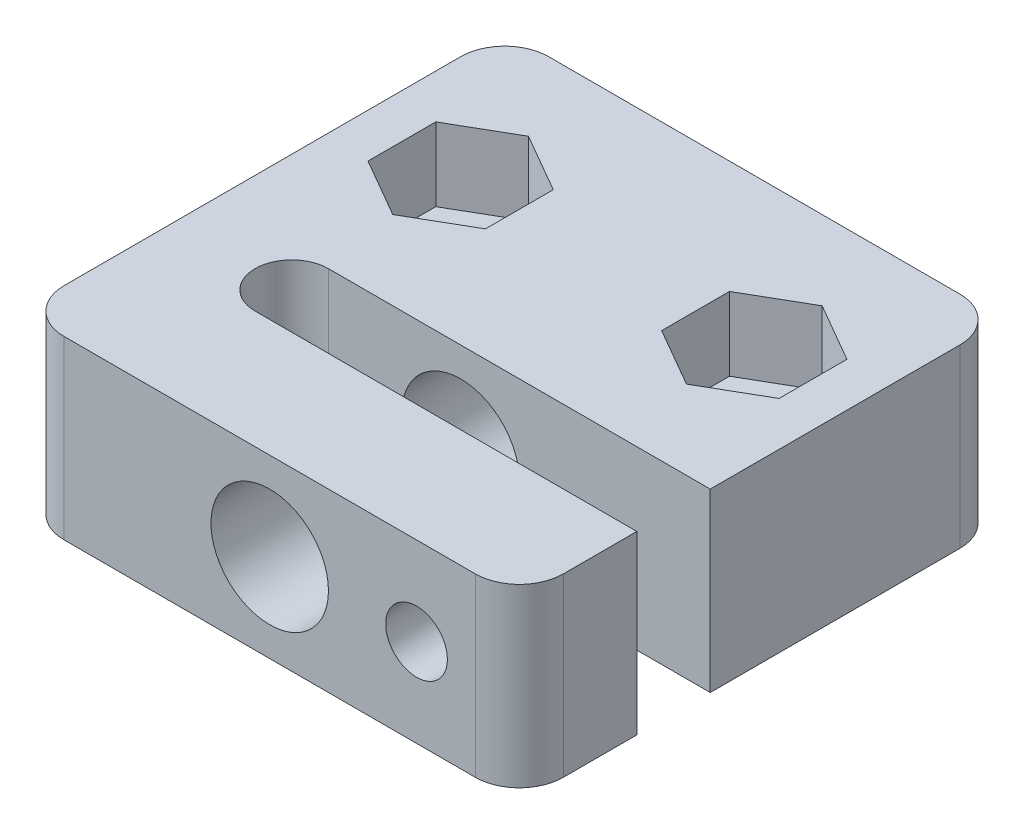
ISO-10303-21;
HEADER;
FILE_DESCRIPTION(('STEP AP214'),'2;1');
FILE_NAME('part.step','',(''),(''),'','','');
FILE_SCHEMA(('AUTOMOTIVE_DESIGN { 1 0 10303 214 1 1 1 1 }'));
ENDSEC;
DATA;
#1=APPLICATION_CONTEXT('core data for automotive mechanical design processes');
#2=APPLICATION_PROTOCOL_DEFINITION('international standard','automotive_design',2000,#1);
#3=PRODUCT_CONTEXT('',#1,'mechanical');
#4=PRODUCT('Part','Part','',(#3));
#5=PRODUCT_RELATED_PRODUCT_CATEGORY('part','',(#4));
#6=PRODUCT_DEFINITION_FORMATION('','',#4);
#7=PRODUCT_DEFINITION_CONTEXT('part definition',#1,'design');
#8=PRODUCT_DEFINITION('design','',#6,#7);
#9=PRODUCT_DEFINITION_SHAPE('','',#8);
#10=(LENGTH_UNIT() NAMED_UNIT(*) SI_UNIT(.MILLI.,.METRE.));
#11=(NAMED_UNIT(*) PLANE_ANGLE_UNIT() SI_UNIT($,.RADIAN.));
#12=(NAMED_UNIT(*) SI_UNIT($,.STERADIAN.) SOLID_ANGLE_UNIT());
#13=UNCERTAINTY_MEASURE_WITH_UNIT(LENGTH_MEASURE(1.E-05),#10,'distance_accuracy_value','');
#14=(GEOMETRIC_REPRESENTATION_CONTEXT(3) GLOBAL_UNCERTAINTY_ASSIGNED_CONTEXT((#13)) GLOBAL_UNIT_ASSIGNED_CONTEXT((#10,
#11,#12)) REPRESENTATION_CONTEXT('',''));
#15=CARTESIAN_POINT('',(0.,0.,0.));
#16=DIRECTION('',(0.,0.,1.));
#17=DIRECTION('',(1.,0.,0.));
#18=AXIS2_PLACEMENT_3D('',#15,#16,#17);
#19=CARTESIAN_POINT('',(17.,-6.,16.5));
#20=DIRECTION('',(-1.,0.,0.));
#21=DIRECTION('',(0.,0.,1.));
#22=AXIS2_PLACEMENT_3D('',#19,#20,#21);
#23=PLANE('',#22);
#24=DIRECTION('',(0.,0.,-1.));
#25=VECTOR('',#24,1.);
#26=CARTESIAN_POINT('',(17.,6.,16.5));
#27=LINE('',#26,#25);
#28=CARTESIAN_POINT('',(17.,6.,13.5));
#29=VERTEX_POINT('',#28);
#30=CARTESIAN_POINT('',(17.,6.,8.5));
#31=VERTEX_POINT('',#30);
#32=EDGE_CURVE('E227',#29,#31,#27,.T.);
#33=ORIENTED_EDGE('',*,*,#32,.F.);
#34=DIRECTION('',(0.,1.,0.));
#35=VECTOR('',#34,1.);
#36=CARTESIAN_POINT('',(17.,-6.,13.5));
#37=LINE('',#36,#35);
#38=CARTESIAN_POINT('',(17.,-6.,13.5));
#39=VERTEX_POINT('',#38);
#40=EDGE_CURVE('E11',#29,#39,#37,.F.);
#41=ORIENTED_EDGE('',*,*,#40,.T.);
#42=DIRECTION('',(0.,0.,-1.));
#43=VECTOR('',#42,1.);
#44=CARTESIAN_POINT('',(17.,-6.,16.5));
#45=LINE('',#44,#43);
#46=CARTESIAN_POINT('',(17.,-6.,8.5));
#47=VERTEX_POINT('',#46);
#48=EDGE_CURVE('E226',#39,#47,#45,.T.);
#49=ORIENTED_EDGE('',*,*,#48,.T.);
#50=DIRECTION('',(0.,1.,0.));
#51=VECTOR('',#50,1.);
#52=CARTESIAN_POINT('',(17.,-6.,8.5));
#53=LINE('',#52,#51);
#54=EDGE_CURVE('E259',#47,#31,#53,.T.);
#55=ORIENTED_EDGE('',*,*,#54,.T.);
#56=EDGE_LOOP('',(#33,#41,#49,#55));
#57=FACE_BOUND('',#56,.T.);
#58=ADVANCED_FACE('F33',(#57),#23,.F.);
#59=CARTESIAN_POINT('',(0.,0.,-16.5));
#60=DIRECTION('',(0.,0.,1.));
#61=DIRECTION('',(1.,0.,0.));
#62=AXIS2_PLACEMENT_3D('',#59,#60,#61);
#63=CYLINDRICAL_SURFACE('',#62,4.);
#64=CARTESIAN_POINT('',(0.,0.,8.5));
#65=DIRECTION('',(0.,0.,1.));
#66=DIRECTION('',(1.,0.,0.));
#67=AXIS2_PLACEMENT_3D('',#64,#65,#66);
#68=CIRCLE('',#67,4.);
#69=CARTESIAN_POINT('',(4.,0.,8.5));
#70=VERTEX_POINT('',#69);
#71=EDGE_CURVE('E258',#70,#70,#68,.F.);
#72=ORIENTED_EDGE('',*,*,#71,.T.);
#73=EDGE_LOOP('',(#72));
#74=FACE_BOUND('',#73,.T.);
#75=CARTESIAN_POINT('',(0.,0.,16.5));
#76=DIRECTION('',(0.,0.,1.));
#77=DIRECTION('',(1.,0.,0.));
#78=AXIS2_PLACEMENT_3D('',#75,#76,#77);
#79=CIRCLE('',#78,4.);
#80=CARTESIAN_POINT('',(4.,0.,16.5));
#81=VERTEX_POINT('',#80);
#82=EDGE_CURVE('E238',#81,#81,#79,.T.);
#83=ORIENTED_EDGE('',*,*,#82,.T.);
#84=EDGE_LOOP('',(#83));
#85=FACE_BOUND('',#84,.T.);
#86=ADVANCED_FACE('F330',(#74,#85),#63,.F.);
#87=CARTESIAN_POINT('',(-10.,-6.00000000000001,-6.5));
#88=DIRECTION('',(0.,1.,0.));
#89=DIRECTION('',(-1.,0.,0.));
#90=AXIS2_PLACEMENT_3D('',#87,#88,#89);
#91=CYLINDRICAL_SURFACE('',#90,2.55);
#92=CARTESIAN_POINT('',(-10.,1.,-6.5));
#93=DIRECTION('',(0.,1.,0.));
#94=DIRECTION('',(0.,0.,1.));
#95=AXIS2_PLACEMENT_3D('',#92,#93,#94);
#96=CIRCLE('',#95,2.55);
#97=CARTESIAN_POINT('',(-10.,1.,-3.95));
#98=VERTEX_POINT('',#97);
#99=EDGE_CURVE('E235',#98,#98,#96,.F.);
#100=ORIENTED_EDGE('',*,*,#99,.F.);
#101=EDGE_LOOP('',(#100));
#102=FACE_BOUND('',#101,.T.);
#103=CARTESIAN_POINT('',(-10.,-4.,-6.5));
#104=DIRECTION('',(0.,-1.,0.));
#105=DIRECTION('',(1.,0.,0.));
#106=AXIS2_PLACEMENT_3D('',#103,#104,#105);
#107=CIRCLE('',#106,2.55);
#108=CARTESIAN_POINT('',(-7.45,-4.,-6.5));
#109=VERTEX_POINT('',#108);
#110=EDGE_CURVE('E250',#109,#109,#107,.F.);
#111=ORIENTED_EDGE('',*,*,#110,.F.);
#112=EDGE_LOOP('',(#111));
#113=FACE_BOUND('',#112,.T.);
#114=ADVANCED_FACE('F336',(#102,#113),#91,.F.);
#115=CARTESIAN_POINT('',(10.,-6.00000000000001,-6.5));
#116=DIRECTION('',(0.,1.,0.));
#117=DIRECTION('',(-1.,0.,0.));
#118=AXIS2_PLACEMENT_3D('',#115,#116,#117);
#119=CYLINDRICAL_SURFACE('',#118,2.55);
#120=CARTESIAN_POINT('',(10.,1.,-6.5));
#121=DIRECTION('',(0.,-1.,0.));
#122=DIRECTION('',(1.,0.,0.));
#123=AXIS2_PLACEMENT_3D('',#120,#121,#122);
#124=CIRCLE('',#123,2.55);
#125=CARTESIAN_POINT('',(12.55,1.,-6.5));
#126=VERTEX_POINT('',#125);
#127=EDGE_CURVE('E240',#126,#126,#124,.F.);
#128=ORIENTED_EDGE('',*,*,#127,.T.);
#129=EDGE_LOOP('',(#128));
#130=FACE_BOUND('',#129,.T.);
#131=CARTESIAN_POINT('',(10.,-4.,-6.5));
#132=DIRECTION('',(0.,-1.,0.));
#133=DIRECTION('',(1.,0.,0.));
#134=AXIS2_PLACEMENT_3D('',#131,#132,#133);
#135=CIRCLE('',#134,2.55);
#136=CARTESIAN_POINT('',(12.55,-4.,-6.5));
#137=VERTEX_POINT('',#136);
#138=EDGE_CURVE('E245',#137,#137,#135,.F.);
#139=ORIENTED_EDGE('',*,*,#138,.F.);
#140=EDGE_LOOP('',(#139));
#141=FACE_BOUND('',#140,.T.);
#142=ADVANCED_FACE('F352',(#130,#141),#119,.F.);
#143=CARTESIAN_POINT('',(-17.,-6.,16.5));
#144=DIRECTION('',(1.,0.,0.));
#145=DIRECTION('',(0.,0.,-1.));
#146=AXIS2_PLACEMENT_3D('',#143,#144,#145);
#147=PLANE('',#146);
#148=DIRECTION('',(0.,0.,-1.));
#149=VECTOR('',#148,1.);
#150=CARTESIAN_POINT('',(-17.,6.,16.5));
#151=LINE('',#150,#149);
#152=CARTESIAN_POINT('',(-17.,6.,13.5));
#153=VERTEX_POINT('',#152);
#154=CARTESIAN_POINT('',(-17.,6.,-13.5));
#155=VERTEX_POINT('',#154);
#156=EDGE_CURVE('E299',#153,#155,#151,.T.);
#157=ORIENTED_EDGE('',*,*,#156,.T.);
#158=DIRECTION('',(0.,-1.,0.));
#159=VECTOR('',#158,1.);
#160=CARTESIAN_POINT('',(-17.,-6.,-13.5));
#161=LINE('',#160,#159);
#162=CARTESIAN_POINT('',(-17.,-6.,-13.5));
#163=VERTEX_POINT('',#162);
#164=EDGE_CURVE('E264',#155,#163,#161,.T.);
#165=ORIENTED_EDGE('',*,*,#164,.T.);
#166=DIRECTION('',(0.,0.,-1.));
#167=VECTOR('',#166,1.);
#168=CARTESIAN_POINT('',(-17.,-6.,16.5));
#169=LINE('',#168,#167);
#170=CARTESIAN_POINT('',(-17.,-6.,13.5));
#171=VERTEX_POINT('',#170);
#172=EDGE_CURVE('E229',#171,#163,#169,.T.);
#173=ORIENTED_EDGE('',*,*,#172,.F.);
#174=DIRECTION('',(0.,-1.,0.));
#175=VECTOR('',#174,1.);
#176=CARTESIAN_POINT('',(-17.,6.,13.5));
#177=LINE('',#176,#175);
#178=EDGE_CURVE('E234',#171,#153,#177,.F.);
#179=ORIENTED_EDGE('',*,*,#178,.T.);
#180=EDGE_LOOP('',(#157,#165,#173,#179));
#181=FACE_BOUND('',#180,.T.);
#182=ADVANCED_FACE('F319',(#181),#147,.F.);
#183=CARTESIAN_POINT('',(17.,-6.,16.5));
#184=DIRECTION('',(0.,1.,0.));
#185=DIRECTION('',(-1.,0.,0.));
#186=AXIS2_PLACEMENT_3D('',#183,#184,#185);
#187=PLANE('',#186);
#188=CARTESIAN_POINT('',(-10.,-6.,-6.5));
#189=DIRECTION('',(0.,-1.,0.));
#190=DIRECTION('',(1.,0.,0.));
#191=AXIS2_PLACEMENT_3D('',#188,#189,#190);
#192=CIRCLE('',#191,4.5);
#193=CARTESIAN_POINT('',(-5.5,-6.,-6.5));
#194=VERTEX_POINT('',#193);
#195=EDGE_CURVE('E262',#194,#194,#192,.T.);
#196=ORIENTED_EDGE('',*,*,#195,.F.);
#197=EDGE_LOOP('',(#196));
#198=FACE_BOUND('',#197,.T.);
#199=CARTESIAN_POINT('',(10.,-6.,-6.5));
#200=DIRECTION('',(0.,-1.,0.));
#201=DIRECTION('',(1.,0.,0.));
#202=AXIS2_PLACEMENT_3D('',#199,#200,#201);
#203=CIRCLE('',#202,4.5);
#204=CARTESIAN_POINT('',(14.5,-6.,-6.5));
#205=VERTEX_POINT('',#204);
#206=EDGE_CURVE('E253',#205,#205,#203,.T.);
#207=ORIENTED_EDGE('',*,*,#206,.F.);
#208=EDGE_LOOP('',(#207));
#209=FACE_BOUND('',#208,.T.);
#210=ORIENTED_EDGE('',*,*,#172,.T.);
#211=CARTESIAN_POINT('',(-14.,-6.,-13.5));
#212=DIRECTION('',(0.,1.,0.));
#213=DIRECTION('',(-1.,0.,0.));
#214=AXIS2_PLACEMENT_3D('',#211,#212,#213);
#215=CIRCLE('',#214,3.);
#216=CARTESIAN_POINT('',(-14.,-6.,-16.5));
#217=VERTEX_POINT('',#216);
#218=EDGE_CURVE('E272',#163,#217,#215,.F.);
#219=ORIENTED_EDGE('',*,*,#218,.T.);
#220=DIRECTION('',(1.,0.,0.));
#221=VECTOR('',#220,1.);
#222=CARTESIAN_POINT('',(17.,-6.,-16.5));
#223=LINE('',#222,#221);
#224=CARTESIAN_POINT('',(14.,-6.,-16.5));
#225=VERTEX_POINT('',#224);
#226=EDGE_CURVE('E306',#217,#225,#223,.T.);
#227=ORIENTED_EDGE('',*,*,#226,.T.);
#228=CARTESIAN_POINT('',(14.,-6.,-13.5));
#229=DIRECTION('',(0.,1.,0.));
#230=DIRECTION('',(-1.,0.,0.));
#231=AXIS2_PLACEMENT_3D('',#228,#229,#230);
#232=CIRCLE('',#231,3.);
#233=CARTESIAN_POINT('',(17.,-6.,-13.5));
#234=VERTEX_POINT('',#233);
#235=EDGE_CURVE('E225',#225,#234,#232,.F.);
#236=ORIENTED_EDGE('',*,*,#235,.T.);
#237=CARTESIAN_POINT('',(17.,-6.,3.5));
#238=VERTEX_POINT('',#237);
#239=EDGE_CURVE('E215',#238,#234,#45,.T.);
#240=ORIENTED_EDGE('',*,*,#239,.F.);
#241=DIRECTION('',(-1.,0.,0.));
#242=VECTOR('',#241,1.);
#243=CARTESIAN_POINT('',(17.,-6.,3.5));
#244=LINE('',#243,#242);
#245=CARTESIAN_POINT('',(-9.,-6.00000000000001,3.5));
#246=VERTEX_POINT('',#245);
#247=EDGE_CURVE('E195',#238,#246,#244,.T.);
#248=ORIENTED_EDGE('',*,*,#247,.T.);
#249=CARTESIAN_POINT('',(-9.,-6.00000000000001,6.));
#250=DIRECTION('',(0.,1.,0.));
#251=DIRECTION('',(-1.,0.,0.));
#252=AXIS2_PLACEMENT_3D('',#249,#250,#251);
#253=CIRCLE('',#252,2.5);
#254=CARTESIAN_POINT('',(-9.,-6.00000000000001,8.5));
#255=VERTEX_POINT('',#254);
#256=EDGE_CURVE('E207',#246,#255,#253,.T.);
#257=ORIENTED_EDGE('',*,*,#256,.T.);
#258=DIRECTION('',(1.,0.,0.));
#259=VECTOR('',#258,1.);
#260=CARTESIAN_POINT('',(17.,-6.,8.5));
#261=LINE('',#260,#259);
#262=EDGE_CURVE('E219',#255,#47,#261,.T.);
#263=ORIENTED_EDGE('',*,*,#262,.T.);
#264=ORIENTED_EDGE('',*,*,#48,.F.);
#265=CARTESIAN_POINT('',(14.,-6.,13.5));
#266=DIRECTION('',(0.,1.,0.));
#267=DIRECTION('',(-1.,0.,0.));
#268=AXIS2_PLACEMENT_3D('',#265,#266,#267);
#269=CIRCLE('',#268,3.);
#270=CARTESIAN_POINT('',(14.,-6.,16.5));
#271=VERTEX_POINT('',#270);
#272=EDGE_CURVE('E269',#39,#271,#269,.F.);
#273=ORIENTED_EDGE('',*,*,#272,.T.);
#274=DIRECTION('',(1.,0.,0.));
#275=VECTOR('',#274,1.);
#276=CARTESIAN_POINT('',(17.,-6.,16.5));
#277=LINE('',#276,#275);
#278=CARTESIAN_POINT('',(-14.,-6.,16.5));
#279=VERTEX_POINT('',#278);
#280=EDGE_CURVE('E294',#279,#271,#277,.T.);
#281=ORIENTED_EDGE('',*,*,#280,.F.);
#282=CARTESIAN_POINT('',(-14.,-6.,13.5));
#283=DIRECTION('',(0.,1.,0.));
#284=DIRECTION('',(-1.,0.,0.));
#285=AXIS2_PLACEMENT_3D('',#282,#283,#284);
#286=CIRCLE('',#285,3.);
#287=EDGE_CURVE('E267',#279,#171,#286,.F.);
#288=ORIENTED_EDGE('',*,*,#287,.T.);
#289=EDGE_LOOP('',(#210,#219,#227,#236,#240,#248,#257,#263,#264,#273,#281,#288));
#290=FACE_BOUND('',#289,.T.);
#291=ADVANCED_FACE('F222',(#198,#209,#290),#187,.F.);
#292=ORIENTED_EDGE('',*,*,#239,.T.);
#293=DIRECTION('',(0.,1.,0.));
#294=VECTOR('',#293,1.);
#295=CARTESIAN_POINT('',(17.,-6.,-13.5));
#296=LINE('',#295,#294);
#297=CARTESIAN_POINT('',(17.,6.,-13.5));
#298=VERTEX_POINT('',#297);
#299=EDGE_CURVE('E284',#234,#298,#296,.T.);
#300=ORIENTED_EDGE('',*,*,#299,.T.);
#301=CARTESIAN_POINT('',(17.,6.,3.5));
#302=VERTEX_POINT('',#301);
#303=EDGE_CURVE('E218',#302,#298,#27,.T.);
#304=ORIENTED_EDGE('',*,*,#303,.F.);
#305=DIRECTION('',(0.,1.,0.));
#306=VECTOR('',#305,1.);
#307=CARTESIAN_POINT('',(17.,-6.,3.5));
#308=LINE('',#307,#306);
#309=EDGE_CURVE('E200',#238,#302,#308,.T.);
#310=ORIENTED_EDGE('',*,*,#309,.F.);
#311=EDGE_LOOP('',(#292,#300,#304,#310));
#312=FACE_BOUND('',#311,.T.);
#313=ADVANCED_FACE('F213',(#312),#23,.F.);
#314=CARTESIAN_POINT('',(17.,6.,16.5));
#315=DIRECTION('',(0.,-1.,0.));
#316=DIRECTION('',(1.,0.,0.));
#317=AXIS2_PLACEMENT_3D('',#314,#315,#316);
#318=PLANE('',#317);
#319=DIRECTION('',(0.866025403784439,0.,0.5));
#320=VECTOR('',#319,1.);
#321=CARTESIAN_POINT('',(10.,6.,-1.881197846483));
#322=LINE('',#321,#320);
#323=CARTESIAN_POINT('',(6.00000000000001,6.,-4.1905989232415));
#324=VERTEX_POINT('',#323);
#325=CARTESIAN_POINT('',(10.,6.,-1.881197846483));
#326=VERTEX_POINT('',#325);
#327=EDGE_CURVE('E414',#324,#326,#322,.T.);
#328=ORIENTED_EDGE('',*,*,#327,.F.);
#329=DIRECTION('',(0.,0.,1.));
#330=VECTOR('',#329,1.);
#331=CARTESIAN_POINT('',(6.,6.,-4.19059892324149));
#332=LINE('',#331,#330);
#333=CARTESIAN_POINT('',(6.,6.,-8.8094010767585));
#334=VERTEX_POINT('',#333);
#335=EDGE_CURVE('E248',#334,#324,#332,.T.);
#336=ORIENTED_EDGE('',*,*,#335,.F.);
#337=DIRECTION('',(-0.866025403784439,0.,0.499999999999999));
#338=VECTOR('',#337,1.);
#339=CARTESIAN_POINT('',(6.,6.,-8.8094010767585));
#340=LINE('',#339,#338);
#341=CARTESIAN_POINT('',(10.,6.,-11.118802153517));
#342=VERTEX_POINT('',#341);
#343=EDGE_CURVE('E397',#342,#334,#340,.T.);
#344=ORIENTED_EDGE('',*,*,#343,.F.);
#345=DIRECTION('',(-0.866025403784439,0.,-0.5));
#346=VECTOR('',#345,1.);
#347=CARTESIAN_POINT('',(10.,6.,-11.118802153517));
#348=LINE('',#347,#346);
#349=CARTESIAN_POINT('',(14.,6.,-8.8094010767585));
#350=VERTEX_POINT('',#349);
#351=EDGE_CURVE('E423',#350,#342,#348,.T.);
#352=ORIENTED_EDGE('',*,*,#351,.F.);
#353=DIRECTION('',(0.,0.,-1.));
#354=VECTOR('',#353,1.);
#355=CARTESIAN_POINT('',(14.,6.,-8.8094010767585));
#356=LINE('',#355,#354);
#357=CARTESIAN_POINT('',(14.,6.,-4.1905989232415));
#358=VERTEX_POINT('',#357);
#359=EDGE_CURVE('E420',#358,#350,#356,.T.);
#360=ORIENTED_EDGE('',*,*,#359,.F.);
#361=DIRECTION('',(0.866025403784439,0.,-0.5));
#362=VECTOR('',#361,1.);
#363=CARTESIAN_POINT('',(14.,6.,-4.1905989232415));
#364=LINE('',#363,#362);
#365=EDGE_CURVE('E417',#326,#358,#364,.T.);
#366=ORIENTED_EDGE('',*,*,#365,.F.);
#367=EDGE_LOOP('',(#328,#336,#344,#352,#360,#366));
#368=FACE_BOUND('',#367,.T.);
#369=DIRECTION('',(-0.866025403784439,0.,0.499999999999999));
#370=VECTOR('',#369,1.);
#371=CARTESIAN_POINT('',(-10.,6.,-11.118802153517));
#372=LINE('',#371,#370);
#373=CARTESIAN_POINT('',(-10.,6.,-11.118802153517));
#374=VERTEX_POINT('',#373);
#375=CARTESIAN_POINT('',(-14.,6.,-8.8094010767585));
#376=VERTEX_POINT('',#375);
#377=EDGE_CURVE('E460',#374,#376,#372,.T.);
#378=ORIENTED_EDGE('',*,*,#377,.F.);
#379=DIRECTION('',(-0.866025403784439,0.,-0.499999999999999));
#380=VECTOR('',#379,1.);
#381=CARTESIAN_POINT('',(-6.,6.,-8.8094010767585));
#382=LINE('',#381,#380);
#383=CARTESIAN_POINT('',(-6.,6.,-8.8094010767585));
#384=VERTEX_POINT('',#383);
#385=EDGE_CURVE('E243',#384,#374,#382,.T.);
#386=ORIENTED_EDGE('',*,*,#385,.F.);
#387=DIRECTION('',(0.,0.,-1.));
#388=VECTOR('',#387,1.);
#389=CARTESIAN_POINT('',(-6.00000000000001,6.,-4.19059892324149));
#390=LINE('',#389,#388);
#391=CARTESIAN_POINT('',(-6.00000000000001,6.,-4.19059892324149));
#392=VERTEX_POINT('',#391);
#393=EDGE_CURVE('E443',#392,#384,#390,.T.);
#394=ORIENTED_EDGE('',*,*,#393,.F.);
#395=DIRECTION('',(0.866025403784439,0.,-0.5));
#396=VECTOR('',#395,1.);
#397=CARTESIAN_POINT('',(-10.,6.,-1.881197846483));
#398=LINE('',#397,#396);
#399=CARTESIAN_POINT('',(-10.,6.,-1.881197846483));
#400=VERTEX_POINT('',#399);
#401=EDGE_CURVE('E469',#400,#392,#398,.T.);
#402=ORIENTED_EDGE('',*,*,#401,.F.);
#403=DIRECTION('',(0.866025403784439,0.,0.5));
#404=VECTOR('',#403,1.);
#405=CARTESIAN_POINT('',(-14.,6.,-4.1905989232415));
#406=LINE('',#405,#404);
#407=CARTESIAN_POINT('',(-14.,6.,-4.1905989232415));
#408=VERTEX_POINT('',#407);
#409=EDGE_CURVE('E466',#408,#400,#406,.T.);
#410=ORIENTED_EDGE('',*,*,#409,.F.);
#411=DIRECTION('',(0.,0.,1.));
#412=VECTOR('',#411,1.);
#413=CARTESIAN_POINT('',(-14.,6.,-8.8094010767585));
#414=LINE('',#413,#412);
#415=EDGE_CURVE('E463',#376,#408,#414,.T.);
#416=ORIENTED_EDGE('',*,*,#415,.F.);
#417=EDGE_LOOP('',(#378,#386,#394,#402,#410,#416));
#418=FACE_BOUND('',#417,.T.);
#419=DIRECTION('',(-1.,0.,0.));
#420=VECTOR('',#419,1.);
#421=CARTESIAN_POINT('',(17.,6.,-16.5));
#422=LINE('',#421,#420);
#423=CARTESIAN_POINT('',(14.,6.,-16.5));
#424=VERTEX_POINT('',#423);
#425=CARTESIAN_POINT('',(-14.,6.,-16.5));
#426=VERTEX_POINT('',#425);
#427=EDGE_CURVE('E302',#424,#426,#422,.T.);
#428=ORIENTED_EDGE('',*,*,#427,.T.);
#429=CARTESIAN_POINT('',(-14.,6.,-13.5));
#430=DIRECTION('',(0.,-1.,0.));
#431=DIRECTION('',(1.,0.,0.));
#432=AXIS2_PLACEMENT_3D('',#429,#430,#431);
#433=CIRCLE('',#432,3.);
#434=EDGE_CURVE('E282',#426,#155,#433,.F.);
#435=ORIENTED_EDGE('',*,*,#434,.T.);
#436=ORIENTED_EDGE('',*,*,#156,.F.);
#437=CARTESIAN_POINT('',(-14.,6.,13.5));
#438=DIRECTION('',(0.,-1.,0.));
#439=DIRECTION('',(1.,0.,0.));
#440=AXIS2_PLACEMENT_3D('',#437,#438,#439);
#441=CIRCLE('',#440,3.);
#442=CARTESIAN_POINT('',(-14.,6.,16.5));
#443=VERTEX_POINT('',#442);
#444=EDGE_CURVE('E48',#153,#443,#441,.F.);
#445=ORIENTED_EDGE('',*,*,#444,.T.);
#446=DIRECTION('',(-1.,0.,0.));
#447=VECTOR('',#446,1.);
#448=CARTESIAN_POINT('',(17.,6.,16.5));
#449=LINE('',#448,#447);
#450=CARTESIAN_POINT('',(14.,6.,16.5));
#451=VERTEX_POINT('',#450);
#452=EDGE_CURVE('E291',#451,#443,#449,.T.);
#453=ORIENTED_EDGE('',*,*,#452,.F.);
#454=CARTESIAN_POINT('',(14.,6.,13.5));
#455=DIRECTION('',(0.,-1.,0.));
#456=DIRECTION('',(1.,0.,0.));
#457=AXIS2_PLACEMENT_3D('',#454,#455,#456);
#458=CIRCLE('',#457,3.);
#459=EDGE_CURVE('E56',#451,#29,#458,.F.);
#460=ORIENTED_EDGE('',*,*,#459,.T.);
#461=ORIENTED_EDGE('',*,*,#32,.T.);
#462=DIRECTION('',(1.,0.,0.));
#463=VECTOR('',#462,1.);
#464=CARTESIAN_POINT('',(17.,6.,8.5));
#465=LINE('',#464,#463);
#466=CARTESIAN_POINT('',(-9.,6.,8.5));
#467=VERTEX_POINT('',#466);
#468=EDGE_CURVE('E208',#467,#31,#465,.T.);
#469=ORIENTED_EDGE('',*,*,#468,.F.);
#470=CARTESIAN_POINT('',(-9.,6.,6.));
#471=DIRECTION('',(0.,1.,0.));
#472=DIRECTION('',(-1.,0.,0.));
#473=AXIS2_PLACEMENT_3D('',#470,#471,#472);
#474=CIRCLE('',#473,2.5);
#475=CARTESIAN_POINT('',(-9.,6.,3.5));
#476=VERTEX_POINT('',#475);
#477=EDGE_CURVE('E368',#476,#467,#474,.T.);
#478=ORIENTED_EDGE('',*,*,#477,.F.);
#479=DIRECTION('',(-1.,0.,0.));
#480=VECTOR('',#479,1.);
#481=CARTESIAN_POINT('',(17.,6.,3.5));
#482=LINE('',#481,#480);
#483=EDGE_CURVE('E365',#302,#476,#482,.T.);
#484=ORIENTED_EDGE('',*,*,#483,.F.);
#485=ORIENTED_EDGE('',*,*,#303,.T.);
#486=CARTESIAN_POINT('',(14.,6.,-13.5));
#487=DIRECTION('',(0.,-1.,0.));
#488=DIRECTION('',(1.,0.,0.));
#489=AXIS2_PLACEMENT_3D('',#486,#487,#488);
#490=CIRCLE('',#489,3.);
#491=EDGE_CURVE('E280',#298,#424,#490,.F.);
#492=ORIENTED_EDGE('',*,*,#491,.T.);
#493=EDGE_LOOP('',(#428,#435,#436,#445,#453,#460,#461,#469,#478,#484,#485,#492));
#494=FACE_BOUND('',#493,.T.);
#495=ADVANCED_FACE('F297',(#368,#418,#494),#318,.F.);
#496=CARTESIAN_POINT('',(0.,0.,16.5));
#497=DIRECTION('',(0.,0.,1.));
#498=DIRECTION('',(1.,0.,0.));
#499=AXIS2_PLACEMENT_3D('',#496,#497,#498);
#500=PLANE('',#499);
#501=CARTESIAN_POINT('',(10.,0.,16.5));
#502=DIRECTION('',(0.,0.,1.));
#503=DIRECTION('',(1.,0.,0.));
#504=AXIS2_PLACEMENT_3D('',#501,#502,#503);
#505=CIRCLE('',#504,2.09999999999999);
#506=CARTESIAN_POINT('',(12.1,0.,16.5));
#507=VERTEX_POINT('',#506);
#508=EDGE_CURVE('E373',#507,#507,#505,.T.);
#509=ORIENTED_EDGE('',*,*,#508,.F.);
#510=EDGE_LOOP('',(#509));
#511=FACE_BOUND('',#510,.T.);
#512=ORIENTED_EDGE('',*,*,#82,.F.);
#513=EDGE_LOOP('',(#512));
#514=FACE_BOUND('',#513,.T.);
#515=ORIENTED_EDGE('',*,*,#280,.T.);
#516=DIRECTION('',(0.,1.,0.));
#517=VECTOR('',#516,1.);
#518=CARTESIAN_POINT('',(14.,6.,16.5));
#519=LINE('',#518,#517);
#520=EDGE_CURVE('E41',#271,#451,#519,.T.);
#521=ORIENTED_EDGE('',*,*,#520,.T.);
#522=ORIENTED_EDGE('',*,*,#452,.T.);
#523=DIRECTION('',(0.,-1.,0.));
#524=VECTOR('',#523,1.);
#525=CARTESIAN_POINT('',(-14.,-6.,16.5));
#526=LINE('',#525,#524);
#527=EDGE_CURVE('E286',#443,#279,#526,.T.);
#528=ORIENTED_EDGE('',*,*,#527,.T.);
#529=EDGE_LOOP('',(#515,#521,#522,#528));
#530=FACE_BOUND('',#529,.T.);
#531=ADVANCED_FACE('F290',(#511,#514,#530),#500,.T.);
#532=CARTESIAN_POINT('',(0.,0.,-16.5));
#533=DIRECTION('',(0.,0.,1.));
#534=DIRECTION('',(1.,0.,0.));
#535=AXIS2_PLACEMENT_3D('',#532,#533,#534);
#536=PLANE('',#535);
#537=CARTESIAN_POINT('',(0.,0.,-16.5));
#538=DIRECTION('',(0.,0.,1.));
#539=DIRECTION('',(1.,0.,0.));
#540=AXIS2_PLACEMENT_3D('',#537,#538,#539);
#541=CIRCLE('',#540,4.);
#542=CARTESIAN_POINT('',(4.,0.,-16.5));
#543=VERTEX_POINT('',#542);
#544=EDGE_CURVE('E308',#543,#543,#541,.T.);
#545=ORIENTED_EDGE('',*,*,#544,.T.);
#546=EDGE_LOOP('',(#545));
#547=FACE_BOUND('',#546,.T.);
#548=ORIENTED_EDGE('',*,*,#226,.F.);
#549=DIRECTION('',(0.,-1.,0.));
#550=VECTOR('',#549,1.);
#551=CARTESIAN_POINT('',(-14.,0.,-16.5));
#552=LINE('',#551,#550);
#553=EDGE_CURVE('E276',#217,#426,#552,.F.);
#554=ORIENTED_EDGE('',*,*,#553,.T.);
#555=ORIENTED_EDGE('',*,*,#427,.F.);
#556=DIRECTION('',(0.,1.,0.));
#557=VECTOR('',#556,1.);
#558=CARTESIAN_POINT('',(14.,0.,-16.5));
#559=LINE('',#558,#557);
#560=EDGE_CURVE('E274',#424,#225,#559,.F.);
#561=ORIENTED_EDGE('',*,*,#560,.T.);
#562=EDGE_LOOP('',(#548,#554,#555,#561));
#563=FACE_BOUND('',#562,.T.);
#564=ADVANCED_FACE('F491',(#547,#563),#536,.F.);
#565=CARTESIAN_POINT('',(0.,0.,3.5));
#566=DIRECTION('',(0.,0.,-1.));
#567=DIRECTION('',(-1.,0.,0.));
#568=AXIS2_PLACEMENT_3D('',#565,#566,#567);
#569=CIRCLE('',#568,4.);
#570=CARTESIAN_POINT('',(-4.,0.,3.5));
#571=VERTEX_POINT('',#570);
#572=EDGE_CURVE('E255',#571,#571,#569,.F.);
#573=ORIENTED_EDGE('',*,*,#572,.T.);
#574=EDGE_LOOP('',(#573));
#575=FACE_BOUND('',#574,.T.);
#576=ORIENTED_EDGE('',*,*,#544,.F.);
#577=EDGE_LOOP('',(#576));
#578=FACE_BOUND('',#577,.T.);
#579=ADVANCED_FACE('F339',(#575,#578),#63,.F.);
#580=CARTESIAN_POINT('',(0.,1.,0.));
#581=DIRECTION('',(0.,1.,0.));
#582=DIRECTION('',(0.,0.,1.));
#583=AXIS2_PLACEMENT_3D('',#580,#581,#582);
#584=PLANE('',#583);
#585=DIRECTION('',(-0.866025403784439,0.,-0.499999999999999));
#586=VECTOR('',#585,1.);
#587=CARTESIAN_POINT('',(-6.,1.,-8.8094010767585));
#588=LINE('',#587,#586);
#589=CARTESIAN_POINT('',(-6.,1.,-8.8094010767585));
#590=VERTEX_POINT('',#589);
#591=CARTESIAN_POINT('',(-10.,1.,-11.118802153517));
#592=VERTEX_POINT('',#591);
#593=EDGE_CURVE('E439',#590,#592,#588,.T.);
#594=ORIENTED_EDGE('',*,*,#593,.T.);
#595=DIRECTION('',(-0.866025403784439,0.,0.499999999999999));
#596=VECTOR('',#595,1.);
#597=CARTESIAN_POINT('',(-10.,1.,-11.118802153517));
#598=LINE('',#597,#596);
#599=CARTESIAN_POINT('',(-14.,1.,-8.8094010767585));
#600=VERTEX_POINT('',#599);
#601=EDGE_CURVE('E442',#592,#600,#598,.T.);
#602=ORIENTED_EDGE('',*,*,#601,.T.);
#603=DIRECTION('',(0.,0.,1.));
#604=VECTOR('',#603,1.);
#605=CARTESIAN_POINT('',(-14.,1.,-8.8094010767585));
#606=LINE('',#605,#604);
#607=CARTESIAN_POINT('',(-14.,1.,-4.1905989232415));
#608=VERTEX_POINT('',#607);
#609=EDGE_CURVE('E446',#600,#608,#606,.T.);
#610=ORIENTED_EDGE('',*,*,#609,.T.);
#611=DIRECTION('',(0.866025403784439,0.,0.5));
#612=VECTOR('',#611,1.);
#613=CARTESIAN_POINT('',(-14.,1.,-4.1905989232415));
#614=LINE('',#613,#612);
#615=CARTESIAN_POINT('',(-10.,1.,-1.881197846483));
#616=VERTEX_POINT('',#615);
#617=EDGE_CURVE('E449',#608,#616,#614,.T.);
#618=ORIENTED_EDGE('',*,*,#617,.T.);
#619=DIRECTION('',(0.866025403784439,0.,-0.5));
#620=VECTOR('',#619,1.);
#621=CARTESIAN_POINT('',(-10.,1.,-1.881197846483));
#622=LINE('',#621,#620);
#623=CARTESIAN_POINT('',(-6.,1.,-4.19059892324149));
#624=VERTEX_POINT('',#623);
#625=EDGE_CURVE('E452',#616,#624,#622,.T.);
#626=ORIENTED_EDGE('',*,*,#625,.T.);
#627=DIRECTION('',(0.,0.,-1.));
#628=VECTOR('',#627,1.);
#629=CARTESIAN_POINT('',(-6.,1.,-4.19059892324149));
#630=LINE('',#629,#628);
#631=EDGE_CURVE('E455',#624,#590,#630,.T.);
#632=ORIENTED_EDGE('',*,*,#631,.T.);
#633=EDGE_LOOP('',(#594,#602,#610,#618,#626,#632));
#634=FACE_BOUND('',#633,.T.);
#635=ORIENTED_EDGE('',*,*,#99,.T.);
#636=EDGE_LOOP('',(#635));
#637=FACE_BOUND('',#636,.T.);
#638=ADVANCED_FACE('F502',(#634,#637),#584,.T.);
#639=CARTESIAN_POINT('',(-6.,1.,-8.8094010767585));
#640=DIRECTION('',(0.499999999999999,0.,-0.866025403784439));
#641=DIRECTION('',(-0.866025403784439,0.,-0.499999999999999));
#642=AXIS2_PLACEMENT_3D('',#639,#640,#641);
#643=PLANE('',#642);
#644=ORIENTED_EDGE('',*,*,#385,.T.);
#645=DIRECTION('',(0.,1.,0.));
#646=VECTOR('',#645,1.);
#647=CARTESIAN_POINT('',(-10.,1.,-11.118802153517));
#648=LINE('',#647,#646);
#649=EDGE_CURVE('E458',#592,#374,#648,.T.);
#650=ORIENTED_EDGE('',*,*,#649,.F.);
#651=ORIENTED_EDGE('',*,*,#593,.F.);
#652=DIRECTION('',(0.,1.,0.));
#653=VECTOR('',#652,1.);
#654=CARTESIAN_POINT('',(-6.,1.,-8.8094010767585));
#655=LINE('',#654,#653);
#656=EDGE_CURVE('E239',#590,#384,#655,.T.);
#657=ORIENTED_EDGE('',*,*,#656,.T.);
#658=EDGE_LOOP('',(#644,#650,#651,#657));
#659=FACE_BOUND('',#658,.T.);
#660=ADVANCED_FACE('F510',(#659),#643,.F.);
#661=CARTESIAN_POINT('',(-6.,1.,-4.19059892324149));
#662=DIRECTION('',(1.,0.,0.));
#663=DIRECTION('',(0.,0.,-1.));
#664=AXIS2_PLACEMENT_3D('',#661,#662,#663);
#665=PLANE('',#664);
#666=ORIENTED_EDGE('',*,*,#393,.T.);
#667=ORIENTED_EDGE('',*,*,#656,.F.);
#668=ORIENTED_EDGE('',*,*,#631,.F.);
#669=DIRECTION('',(0.,1.,0.));
#670=VECTOR('',#669,1.);
#671=CARTESIAN_POINT('',(-6.,1.,-4.19059892324149));
#672=LINE('',#671,#670);
#673=EDGE_CURVE('E475',#624,#392,#672,.T.);
#674=ORIENTED_EDGE('',*,*,#673,.T.);
#675=EDGE_LOOP('',(#666,#667,#668,#674));
#676=FACE_BOUND('',#675,.T.);
#677=ADVANCED_FACE('F513',(#676),#665,.F.);
#678=CARTESIAN_POINT('',(-10.,1.,-1.881197846483));
#679=DIRECTION('',(0.5,0.,0.866025403784439));
#680=DIRECTION('',(0.866025403784439,0.,-0.5));
#681=AXIS2_PLACEMENT_3D('',#678,#679,#680);
#682=PLANE('',#681);
#683=ORIENTED_EDGE('',*,*,#401,.T.);
#684=ORIENTED_EDGE('',*,*,#673,.F.);
#685=ORIENTED_EDGE('',*,*,#625,.F.);
#686=DIRECTION('',(0.,1.,0.));
#687=VECTOR('',#686,1.);
#688=CARTESIAN_POINT('',(-10.,1.,-1.881197846483));
#689=LINE('',#688,#687);
#690=EDGE_CURVE('E477',#616,#400,#689,.T.);
#691=ORIENTED_EDGE('',*,*,#690,.T.);
#692=EDGE_LOOP('',(#683,#684,#685,#691));
#693=FACE_BOUND('',#692,.T.);
#694=ADVANCED_FACE('F527',(#693),#682,.F.);
#695=CARTESIAN_POINT('',(-14.,1.,-4.1905989232415));
#696=DIRECTION('',(-0.5,0.,0.866025403784439));
#697=DIRECTION('',(0.866025403784439,0.,0.5));
#698=AXIS2_PLACEMENT_3D('',#695,#696,#697);
#699=PLANE('',#698);
#700=ORIENTED_EDGE('',*,*,#409,.T.);
#701=ORIENTED_EDGE('',*,*,#690,.F.);
#702=ORIENTED_EDGE('',*,*,#617,.F.);
#703=DIRECTION('',(0.,1.,0.));
#704=VECTOR('',#703,1.);
#705=CARTESIAN_POINT('',(-14.,1.,-4.1905989232415));
#706=LINE('',#705,#704);
#707=EDGE_CURVE('E479',#608,#408,#706,.T.);
#708=ORIENTED_EDGE('',*,*,#707,.T.);
#709=EDGE_LOOP('',(#700,#701,#702,#708));
#710=FACE_BOUND('',#709,.T.);
#711=ADVANCED_FACE('F523',(#710),#699,.F.);
#712=CARTESIAN_POINT('',(-14.,1.,-8.8094010767585));
#713=DIRECTION('',(-1.,0.,0.));
#714=DIRECTION('',(0.,-1.,0.));
#715=AXIS2_PLACEMENT_3D('',#712,#713,#714);
#716=PLANE('',#715);
#717=ORIENTED_EDGE('',*,*,#415,.T.);
#718=ORIENTED_EDGE('',*,*,#707,.F.);
#719=ORIENTED_EDGE('',*,*,#609,.F.);
#720=DIRECTION('',(0.,1.,0.));
#721=VECTOR('',#720,1.);
#722=CARTESIAN_POINT('',(-14.,1.,-8.8094010767585));
#723=LINE('',#722,#721);
#724=EDGE_CURVE('E481',#600,#376,#723,.T.);
#725=ORIENTED_EDGE('',*,*,#724,.T.);
#726=EDGE_LOOP('',(#717,#718,#719,#725));
#727=FACE_BOUND('',#726,.T.);
#728=ADVANCED_FACE('F519',(#727),#716,.F.);
#729=CARTESIAN_POINT('',(-10.,1.,-11.118802153517));
#730=DIRECTION('',(-0.499999999999999,0.,-0.866025403784439));
#731=DIRECTION('',(-0.866025403784439,0.,0.499999999999999));
#732=AXIS2_PLACEMENT_3D('',#729,#730,#731);
#733=PLANE('',#732);
#734=ORIENTED_EDGE('',*,*,#377,.T.);
#735=ORIENTED_EDGE('',*,*,#724,.F.);
#736=ORIENTED_EDGE('',*,*,#601,.F.);
#737=ORIENTED_EDGE('',*,*,#649,.T.);
#738=EDGE_LOOP('',(#734,#735,#736,#737));
#739=FACE_BOUND('',#738,.T.);
#740=ADVANCED_FACE('F515',(#739),#733,.F.);
#741=CARTESIAN_POINT('',(0.,1.,0.));
#742=DIRECTION('',(0.,-1.,0.));
#743=DIRECTION('',(1.,0.,0.));
#744=AXIS2_PLACEMENT_3D('',#741,#742,#743);
#745=PLANE('',#744);
#746=DIRECTION('',(0.,0.,1.));
#747=VECTOR('',#746,1.);
#748=CARTESIAN_POINT('',(6.,1.,-4.19059892324149));
#749=LINE('',#748,#747);
#750=CARTESIAN_POINT('',(6.,1.,-8.8094010767585));
#751=VERTEX_POINT('',#750);
#752=CARTESIAN_POINT('',(6.,1.,-4.19059892324149));
#753=VERTEX_POINT('',#752);
#754=EDGE_CURVE('E393',#751,#753,#749,.T.);
#755=ORIENTED_EDGE('',*,*,#754,.T.);
#756=DIRECTION('',(0.866025403784439,0.,0.5));
#757=VECTOR('',#756,1.);
#758=CARTESIAN_POINT('',(10.,1.,-1.881197846483));
#759=LINE('',#758,#757);
#760=CARTESIAN_POINT('',(10.,1.,-1.881197846483));
#761=VERTEX_POINT('',#760);
#762=EDGE_CURVE('E396',#753,#761,#759,.T.);
#763=ORIENTED_EDGE('',*,*,#762,.T.);
#764=DIRECTION('',(0.866025403784439,0.,-0.5));
#765=VECTOR('',#764,1.);
#766=CARTESIAN_POINT('',(14.,1.,-4.1905989232415));
#767=LINE('',#766,#765);
#768=CARTESIAN_POINT('',(14.,1.,-4.1905989232415));
#769=VERTEX_POINT('',#768);
#770=EDGE_CURVE('E400',#761,#769,#767,.T.);
#771=ORIENTED_EDGE('',*,*,#770,.T.);
#772=DIRECTION('',(0.,0.,-1.));
#773=VECTOR('',#772,1.);
#774=CARTESIAN_POINT('',(14.,1.,-8.8094010767585));
#775=LINE('',#774,#773);
#776=CARTESIAN_POINT('',(14.,1.,-8.8094010767585));
#777=VERTEX_POINT('',#776);
#778=EDGE_CURVE('E403',#769,#777,#775,.T.);
#779=ORIENTED_EDGE('',*,*,#778,.T.);
#780=DIRECTION('',(-0.866025403784439,0.,-0.5));
#781=VECTOR('',#780,1.);
#782=CARTESIAN_POINT('',(10.,1.,-11.118802153517));
#783=LINE('',#782,#781);
#784=CARTESIAN_POINT('',(10.,1.,-11.118802153517));
#785=VERTEX_POINT('',#784);
#786=EDGE_CURVE('E406',#777,#785,#783,.T.);
#787=ORIENTED_EDGE('',*,*,#786,.T.);
#788=DIRECTION('',(-0.866025403784439,0.,0.499999999999999));
#789=VECTOR('',#788,1.);
#790=CARTESIAN_POINT('',(6.,1.,-8.8094010767585));
#791=LINE('',#790,#789);
#792=EDGE_CURVE('E409',#785,#751,#791,.T.);
#793=ORIENTED_EDGE('',*,*,#792,.T.);
#794=EDGE_LOOP('',(#755,#763,#771,#779,#787,#793));
#795=FACE_BOUND('',#794,.T.);
#796=ORIENTED_EDGE('',*,*,#127,.F.);
#797=EDGE_LOOP('',(#796));
#798=FACE_BOUND('',#797,.T.);
#799=ADVANCED_FACE('F518',(#795,#798),#745,.F.);
#800=CARTESIAN_POINT('',(6.,1.,-4.19059892324149));
#801=DIRECTION('',(-1.,0.,0.));
#802=DIRECTION('',(0.,0.,1.));
#803=AXIS2_PLACEMENT_3D('',#800,#801,#802);
#804=PLANE('',#803);
#805=ORIENTED_EDGE('',*,*,#335,.T.);
#806=DIRECTION('',(0.,1.,0.));
#807=VECTOR('',#806,1.);
#808=CARTESIAN_POINT('',(6.,1.,-4.19059892324149));
#809=LINE('',#808,#807);
#810=EDGE_CURVE('E412',#753,#324,#809,.T.);
#811=ORIENTED_EDGE('',*,*,#810,.F.);
#812=ORIENTED_EDGE('',*,*,#754,.F.);
#813=DIRECTION('',(0.,1.,0.));
#814=VECTOR('',#813,1.);
#815=CARTESIAN_POINT('',(6.,1.,-8.8094010767585));
#816=LINE('',#815,#814);
#817=EDGE_CURVE('E244',#751,#334,#816,.T.);
#818=ORIENTED_EDGE('',*,*,#817,.T.);
#819=EDGE_LOOP('',(#805,#811,#812,#818));
#820=FACE_BOUND('',#819,.T.);
#821=ADVANCED_FACE('F538',(#820),#804,.F.);
#822=CARTESIAN_POINT('',(6.,1.,-8.8094010767585));
#823=DIRECTION('',(-0.499999999999999,0.,-0.866025403784439));
#824=DIRECTION('',(-0.866025403784439,0.,0.499999999999999));
#825=AXIS2_PLACEMENT_3D('',#822,#823,#824);
#826=PLANE('',#825);
#827=ORIENTED_EDGE('',*,*,#343,.T.);
#828=ORIENTED_EDGE('',*,*,#817,.F.);
#829=ORIENTED_EDGE('',*,*,#792,.F.);
#830=DIRECTION('',(0.,1.,0.));
#831=VECTOR('',#830,1.);
#832=CARTESIAN_POINT('',(10.,1.,-11.118802153517));
#833=LINE('',#832,#831);
#834=EDGE_CURVE('E429',#785,#342,#833,.T.);
#835=ORIENTED_EDGE('',*,*,#834,.T.);
#836=EDGE_LOOP('',(#827,#828,#829,#835));
#837=FACE_BOUND('',#836,.T.);
#838=ADVANCED_FACE('F541',(#837),#826,.F.);
#839=CARTESIAN_POINT('',(10.,1.,-11.118802153517));
#840=DIRECTION('',(0.5,0.,-0.866025403784439));
#841=DIRECTION('',(-0.866025403784439,0.,-0.5));
#842=AXIS2_PLACEMENT_3D('',#839,#840,#841);
#843=PLANE('',#842);
#844=ORIENTED_EDGE('',*,*,#351,.T.);
#845=ORIENTED_EDGE('',*,*,#834,.F.);
#846=ORIENTED_EDGE('',*,*,#786,.F.);
#847=DIRECTION('',(0.,1.,0.));
#848=VECTOR('',#847,1.);
#849=CARTESIAN_POINT('',(14.,1.,-8.8094010767585));
#850=LINE('',#849,#848);
#851=EDGE_CURVE('E431',#777,#350,#850,.T.);
#852=ORIENTED_EDGE('',*,*,#851,.T.);
#853=EDGE_LOOP('',(#844,#845,#846,#852));
#854=FACE_BOUND('',#853,.T.);
#855=ADVANCED_FACE('F555',(#854),#843,.F.);
#856=CARTESIAN_POINT('',(14.,1.,-8.8094010767585));
#857=DIRECTION('',(1.,0.,0.));
#858=DIRECTION('',(0.,1.,0.));
#859=AXIS2_PLACEMENT_3D('',#856,#857,#858);
#860=PLANE('',#859);
#861=ORIENTED_EDGE('',*,*,#359,.T.);
#862=ORIENTED_EDGE('',*,*,#851,.F.);
#863=ORIENTED_EDGE('',*,*,#778,.F.);
#864=DIRECTION('',(0.,1.,0.));
#865=VECTOR('',#864,1.);
#866=CARTESIAN_POINT('',(14.,1.,-4.1905989232415));
#867=LINE('',#866,#865);
#868=EDGE_CURVE('E433',#769,#358,#867,.T.);
#869=ORIENTED_EDGE('',*,*,#868,.T.);
#870=EDGE_LOOP('',(#861,#862,#863,#869));
#871=FACE_BOUND('',#870,.T.);
#872=ADVANCED_FACE('F551',(#871),#860,.F.);
#873=CARTESIAN_POINT('',(14.,1.,-4.1905989232415));
#874=DIRECTION('',(0.5,0.,0.866025403784439));
#875=DIRECTION('',(0.866025403784439,0.,-0.5));
#876=AXIS2_PLACEMENT_3D('',#873,#874,#875);
#877=PLANE('',#876);
#878=ORIENTED_EDGE('',*,*,#365,.T.);
#879=ORIENTED_EDGE('',*,*,#868,.F.);
#880=ORIENTED_EDGE('',*,*,#770,.F.);
#881=DIRECTION('',(0.,1.,0.));
#882=VECTOR('',#881,1.);
#883=CARTESIAN_POINT('',(10.,1.,-1.881197846483));
#884=LINE('',#883,#882);
#885=EDGE_CURVE('E435',#761,#326,#884,.T.);
#886=ORIENTED_EDGE('',*,*,#885,.T.);
#887=EDGE_LOOP('',(#878,#879,#880,#886));
#888=FACE_BOUND('',#887,.T.);
#889=ADVANCED_FACE('F547',(#888),#877,.F.);
#890=CARTESIAN_POINT('',(10.,1.,-1.881197846483));
#891=DIRECTION('',(-0.5,0.,0.866025403784439));
#892=DIRECTION('',(0.866025403784439,0.,0.5));
#893=AXIS2_PLACEMENT_3D('',#890,#891,#892);
#894=PLANE('',#893);
#895=ORIENTED_EDGE('',*,*,#327,.T.);
#896=ORIENTED_EDGE('',*,*,#885,.F.);
#897=ORIENTED_EDGE('',*,*,#762,.F.);
#898=ORIENTED_EDGE('',*,*,#810,.T.);
#899=EDGE_LOOP('',(#895,#896,#897,#898));
#900=FACE_BOUND('',#899,.T.);
#901=ADVANCED_FACE('F543',(#900),#894,.F.);
#902=CARTESIAN_POINT('',(10.,-4.,-6.5));
#903=DIRECTION('',(0.,-1.,0.));
#904=DIRECTION('',(1.,0.,0.));
#905=AXIS2_PLACEMENT_3D('',#902,#903,#904);
#906=PLANE('',#905);
#907=CARTESIAN_POINT('',(10.,-4.,-6.5));
#908=DIRECTION('',(0.,-1.,0.));
#909=DIRECTION('',(1.,0.,0.));
#910=AXIS2_PLACEMENT_3D('',#907,#908,#909);
#911=CIRCLE('',#910,4.5);
#912=CARTESIAN_POINT('',(14.5,-4.,-6.5));
#913=VERTEX_POINT('',#912);
#914=EDGE_CURVE('E249',#913,#913,#911,.T.);
#915=ORIENTED_EDGE('',*,*,#914,.T.);
#916=EDGE_LOOP('',(#915));
#917=FACE_BOUND('',#916,.T.);
#918=ORIENTED_EDGE('',*,*,#138,.T.);
#919=EDGE_LOOP('',(#918));
#920=FACE_BOUND('',#919,.T.);
#921=ADVANCED_FACE('F546',(#917,#920),#906,.T.);
#922=CARTESIAN_POINT('',(10.,-4.,-6.5));
#923=DIRECTION('',(0.,-1.,0.));
#924=DIRECTION('',(1.,0.,0.));
#925=AXIS2_PLACEMENT_3D('',#922,#923,#924);
#926=CYLINDRICAL_SURFACE('',#925,4.5);
#927=ORIENTED_EDGE('',*,*,#914,.F.);
#928=EDGE_LOOP('',(#927));
#929=FACE_BOUND('',#928,.T.);
#930=ORIENTED_EDGE('',*,*,#206,.T.);
#931=EDGE_LOOP('',(#930));
#932=FACE_BOUND('',#931,.T.);
#933=ADVANCED_FACE('F566',(#929,#932),#926,.F.);
#934=CARTESIAN_POINT('',(-10.,-4.,-6.5));
#935=DIRECTION('',(0.,-1.,0.));
#936=DIRECTION('',(1.,0.,0.));
#937=AXIS2_PLACEMENT_3D('',#934,#935,#936);
#938=PLANE('',#937);
#939=CARTESIAN_POINT('',(-10.,-4.,-6.5));
#940=DIRECTION('',(0.,-1.,0.));
#941=DIRECTION('',(1.,0.,0.));
#942=AXIS2_PLACEMENT_3D('',#939,#940,#941);
#943=CIRCLE('',#942,4.5);
#944=CARTESIAN_POINT('',(-5.5,-4.,-6.5));
#945=VERTEX_POINT('',#944);
#946=EDGE_CURVE('E254',#945,#945,#943,.T.);
#947=ORIENTED_EDGE('',*,*,#946,.T.);
#948=EDGE_LOOP('',(#947));
#949=FACE_BOUND('',#948,.T.);
#950=ORIENTED_EDGE('',*,*,#110,.T.);
#951=EDGE_LOOP('',(#950));
#952=FACE_BOUND('',#951,.T.);
#953=ADVANCED_FACE('F569',(#949,#952),#938,.T.);
#954=CARTESIAN_POINT('',(-10.,-4.,-6.5));
#955=DIRECTION('',(0.,-1.,0.));
#956=DIRECTION('',(1.,0.,0.));
#957=AXIS2_PLACEMENT_3D('',#954,#955,#956);
#958=CYLINDRICAL_SURFACE('',#957,4.5);
#959=ORIENTED_EDGE('',*,*,#946,.F.);
#960=EDGE_LOOP('',(#959));
#961=FACE_BOUND('',#960,.T.);
#962=ORIENTED_EDGE('',*,*,#195,.T.);
#963=EDGE_LOOP('',(#962));
#964=FACE_BOUND('',#963,.T.);
#965=ADVANCED_FACE('F574',(#961,#964),#958,.F.);
#966=CARTESIAN_POINT('',(17.,-6.,8.5));
#967=DIRECTION('',(0.,0.,1.));
#968=DIRECTION('',(1.,0.,0.));
#969=AXIS2_PLACEMENT_3D('',#966,#967,#968);
#970=PLANE('',#969);
#971=CARTESIAN_POINT('',(10.,0.,8.5));
#972=DIRECTION('',(0.,0.,1.));
#973=DIRECTION('',(1.,0.,0.));
#974=AXIS2_PLACEMENT_3D('',#971,#972,#973);
#975=CIRCLE('',#974,2.09999999999999);
#976=CARTESIAN_POINT('',(12.1,0.,8.5));
#977=VERTEX_POINT('',#976);
#978=EDGE_CURVE('E369',#977,#977,#975,.T.);
#979=ORIENTED_EDGE('',*,*,#978,.T.);
#980=EDGE_LOOP('',(#979));
#981=FACE_BOUND('',#980,.T.);
#982=ORIENTED_EDGE('',*,*,#468,.T.);
#983=ORIENTED_EDGE('',*,*,#54,.F.);
#984=ORIENTED_EDGE('',*,*,#262,.F.);
#985=DIRECTION('',(0.,1.,0.));
#986=VECTOR('',#985,1.);
#987=CARTESIAN_POINT('',(-9.,-6.00000000000001,8.5));
#988=LINE('',#987,#986);
#989=EDGE_CURVE('E382',#255,#467,#988,.T.);
#990=ORIENTED_EDGE('',*,*,#989,.T.);
#991=EDGE_LOOP('',(#982,#983,#984,#990));
#992=FACE_BOUND('',#991,.T.);
#993=ORIENTED_EDGE('',*,*,#71,.F.);
#994=EDGE_LOOP('',(#993));
#995=FACE_BOUND('',#994,.T.);
#996=ADVANCED_FACE('F577',(#981,#992,#995),#970,.F.);
#997=CARTESIAN_POINT('',(17.,-6.,3.5));
#998=DIRECTION('',(0.,0.,-1.));
#999=DIRECTION('',(-1.,0.,0.));
#1000=AXIS2_PLACEMENT_3D('',#997,#998,#999);
#1001=PLANE('',#1000);
#1002=ORIENTED_EDGE('',*,*,#483,.T.);
#1003=DIRECTION('',(0.,1.,0.));
#1004=VECTOR('',#1003,1.);
#1005=CARTESIAN_POINT('',(-9.,-6.00000000000001,3.5));
#1006=LINE('',#1005,#1004);
#1007=EDGE_CURVE('E202',#246,#476,#1006,.T.);
#1008=ORIENTED_EDGE('',*,*,#1007,.F.);
#1009=ORIENTED_EDGE('',*,*,#247,.F.);
#1010=ORIENTED_EDGE('',*,*,#309,.T.);
#1011=EDGE_LOOP('',(#1002,#1008,#1009,#1010));
#1012=FACE_BOUND('',#1011,.T.);
#1013=ORIENTED_EDGE('',*,*,#572,.F.);
#1014=EDGE_LOOP('',(#1013));
#1015=FACE_BOUND('',#1014,.T.);
#1016=ADVANCED_FACE('F198',(#1012,#1015),#1001,.F.);
#1017=CARTESIAN_POINT('',(-9.,-6.00000000000001,6.));
#1018=DIRECTION('',(0.,1.,0.));
#1019=DIRECTION('',(-1.,0.,0.));
#1020=AXIS2_PLACEMENT_3D('',#1017,#1018,#1019);
#1021=CYLINDRICAL_SURFACE('',#1020,2.5);
#1022=ORIENTED_EDGE('',*,*,#477,.T.);
#1023=ORIENTED_EDGE('',*,*,#989,.F.);
#1024=ORIENTED_EDGE('',*,*,#256,.F.);
#1025=ORIENTED_EDGE('',*,*,#1007,.T.);
#1026=EDGE_LOOP('',(#1022,#1023,#1024,#1025));
#1027=FACE_BOUND('',#1026,.T.);
#1028=ADVANCED_FACE('F584',(#1027),#1021,.F.);
#1029=CARTESIAN_POINT('',(10.,0.,16.5));
#1030=DIRECTION('',(0.,0.,1.));
#1031=DIRECTION('',(1.,0.,0.));
#1032=AXIS2_PLACEMENT_3D('',#1029,#1030,#1031);
#1033=CYLINDRICAL_SURFACE('',#1032,2.09999999999999);
#1034=ORIENTED_EDGE('',*,*,#978,.F.);
#1035=EDGE_LOOP('',(#1034));
#1036=FACE_BOUND('',#1035,.T.);
#1037=ORIENTED_EDGE('',*,*,#508,.T.);
#1038=EDGE_LOOP('',(#1037));
#1039=FACE_BOUND('',#1038,.T.);
#1040=ADVANCED_FACE('F359',(#1036,#1039),#1033,.F.);
#1041=CARTESIAN_POINT('',(-14.,-6.,-13.5));
#1042=DIRECTION('',(0.,-1.,0.));
#1043=DIRECTION('',(0.,0.,-1.));
#1044=AXIS2_PLACEMENT_3D('',#1041,#1042,#1043);
#1045=CYLINDRICAL_SURFACE('',#1044,3.);
#1046=ORIENTED_EDGE('',*,*,#434,.F.);
#1047=ORIENTED_EDGE('',*,*,#553,.F.);
#1048=ORIENTED_EDGE('',*,*,#218,.F.);
#1049=ORIENTED_EDGE('',*,*,#164,.F.);
#1050=EDGE_LOOP('',(#1046,#1047,#1048,#1049));
#1051=FACE_BOUND('',#1050,.T.);
#1052=ADVANCED_FACE('F316',(#1051),#1045,.T.);
#1053=CARTESIAN_POINT('',(14.,-6.,-13.5));
#1054=DIRECTION('',(0.,1.,0.));
#1055=DIRECTION('',(0.,0.,1.));
#1056=AXIS2_PLACEMENT_3D('',#1053,#1054,#1055);
#1057=CYLINDRICAL_SURFACE('',#1056,3.);
#1058=ORIENTED_EDGE('',*,*,#235,.F.);
#1059=ORIENTED_EDGE('',*,*,#560,.F.);
#1060=ORIENTED_EDGE('',*,*,#491,.F.);
#1061=ORIENTED_EDGE('',*,*,#299,.F.);
#1062=EDGE_LOOP('',(#1058,#1059,#1060,#1061));
#1063=FACE_BOUND('',#1062,.T.);
#1064=ADVANCED_FACE('F328',(#1063),#1057,.T.);
#1065=CARTESIAN_POINT('',(14.,0.,13.5));
#1066=DIRECTION('',(0.,-1.,0.));
#1067=DIRECTION('',(0.,0.,-1.));
#1068=AXIS2_PLACEMENT_3D('',#1065,#1066,#1067);
#1069=CYLINDRICAL_SURFACE('',#1068,3.);
#1070=ORIENTED_EDGE('',*,*,#272,.F.);
#1071=ORIENTED_EDGE('',*,*,#40,.F.);
#1072=ORIENTED_EDGE('',*,*,#459,.F.);
#1073=ORIENTED_EDGE('',*,*,#520,.F.);
#1074=EDGE_LOOP('',(#1070,#1071,#1072,#1073));
#1075=FACE_BOUND('',#1074,.T.);
#1076=ADVANCED_FACE('F324',(#1075),#1069,.T.);
#1077=CARTESIAN_POINT('',(-14.,0.,13.5));
#1078=DIRECTION('',(0.,1.,0.));
#1079=DIRECTION('',(0.,0.,1.));
#1080=AXIS2_PLACEMENT_3D('',#1077,#1078,#1079);
#1081=CYLINDRICAL_SURFACE('',#1080,3.);
#1082=ORIENTED_EDGE('',*,*,#444,.F.);
#1083=ORIENTED_EDGE('',*,*,#178,.F.);
#1084=ORIENTED_EDGE('',*,*,#287,.F.);
#1085=ORIENTED_EDGE('',*,*,#527,.F.);
#1086=EDGE_LOOP('',(#1082,#1083,#1084,#1085));
#1087=FACE_BOUND('',#1086,.T.);
#1088=ADVANCED_FACE('F35',(#1087),#1081,.T.);
#1089=CLOSED_SHELL('',(#58,#86,#114,#142,#182,#291,#313,#495,#531,#564,#579,#638,#660,#677,#694,
#711,#728,#740,#799,#821,#838,#855,#872,#889,#901,#921,#933,#953,#965,#996,#1016,#1028,#1040,
#1052,#1064,#1076,#1088));
#1090=MANIFOLD_SOLID_BREP('B2',#1089);
#1091=ADVANCED_BREP_SHAPE_REPRESENTATION('',(#18,#1090),#14);
#1092=SHAPE_DEFINITION_REPRESENTATION(#9,#1091);
ENDSEC;
END-ISO-10303-21;
